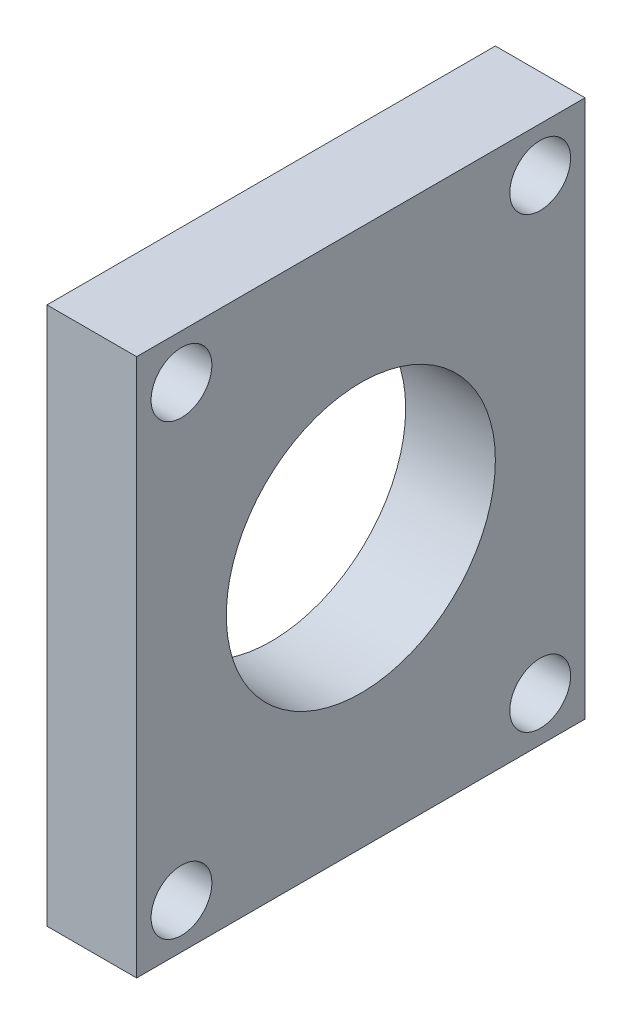
ISO-10303-21;
HEADER;
FILE_DESCRIPTION(('STEP AP214'),'2;1');
FILE_NAME('part.step','',(''),(''),'','','');
FILE_SCHEMA(('AUTOMOTIVE_DESIGN { 1 0 10303 214 1 1 1 1 }'));
ENDSEC;
DATA;
#1=APPLICATION_CONTEXT('core data for automotive mechanical design processes');
#2=APPLICATION_PROTOCOL_DEFINITION('international standard','automotive_design',2000,#1);
#3=PRODUCT_CONTEXT('',#1,'mechanical');
#4=PRODUCT('Part','Part','',(#3));
#5=PRODUCT_RELATED_PRODUCT_CATEGORY('part','',(#4));
#6=PRODUCT_DEFINITION_FORMATION('','',#4);
#7=PRODUCT_DEFINITION_CONTEXT('part definition',#1,'design');
#8=PRODUCT_DEFINITION('design','',#6,#7);
#9=PRODUCT_DEFINITION_SHAPE('','',#8);
#10=(LENGTH_UNIT() NAMED_UNIT(*) SI_UNIT(.MILLI.,.METRE.));
#11=(NAMED_UNIT(*) PLANE_ANGLE_UNIT() SI_UNIT($,.RADIAN.));
#12=(NAMED_UNIT(*) SI_UNIT($,.STERADIAN.) SOLID_ANGLE_UNIT());
#13=UNCERTAINTY_MEASURE_WITH_UNIT(LENGTH_MEASURE(1.E-05),#10,'distance_accuracy_value','');
#14=(GEOMETRIC_REPRESENTATION_CONTEXT(3) GLOBAL_UNCERTAINTY_ASSIGNED_CONTEXT((#13)) GLOBAL_UNIT_ASSIGNED_CONTEXT((#10,
#11,#12)) REPRESENTATION_CONTEXT('',''));
#15=CARTESIAN_POINT('',(0.,0.,0.));
#16=DIRECTION('',(0.,0.,1.));
#17=DIRECTION('',(1.,0.,0.));
#18=AXIS2_PLACEMENT_3D('',#15,#16,#17);
#19=CARTESIAN_POINT('',(3.175,0.,-15.875));
#20=DIRECTION('',(0.,0.,1.));
#21=DIRECTION('',(1.,0.,0.));
#22=AXIS2_PLACEMENT_3D('',#19,#20,#21);
#23=PLANE('',#22);
#24=DIRECTION('',(0.,1.,0.));
#25=VECTOR('',#24,1.);
#26=CARTESIAN_POINT('',(-3.175,0.,-15.875));
#27=LINE('',#26,#25);
#28=CARTESIAN_POINT('',(-3.175,0.,-15.875));
#29=VERTEX_POINT('',#28);
#30=CARTESIAN_POINT('',(-3.175,38.1,-15.875));
#31=VERTEX_POINT('',#30);
#32=EDGE_CURVE('E96',#29,#31,#27,.T.);
#33=ORIENTED_EDGE('',*,*,#32,.T.);
#34=DIRECTION('',(-1.,0.,0.));
#35=VECTOR('',#34,1.);
#36=CARTESIAN_POINT('',(3.175,38.1,-15.875));
#37=LINE('',#36,#35);
#38=CARTESIAN_POINT('',(3.175,38.1,-15.875));
#39=VERTEX_POINT('',#38);
#40=EDGE_CURVE('E11',#39,#31,#37,.T.);
#41=ORIENTED_EDGE('',*,*,#40,.F.);
#42=DIRECTION('',(0.,1.,0.));
#43=VECTOR('',#42,1.);
#44=CARTESIAN_POINT('',(3.175,0.,-15.875));
#45=LINE('',#44,#43);
#46=CARTESIAN_POINT('',(3.175,0.,-15.875));
#47=VERTEX_POINT('',#46);
#48=EDGE_CURVE('E84',#47,#39,#45,.T.);
#49=ORIENTED_EDGE('',*,*,#48,.F.);
#50=DIRECTION('',(-1.,0.,0.));
#51=VECTOR('',#50,1.);
#52=CARTESIAN_POINT('',(3.175,0.,-15.875));
#53=LINE('',#52,#51);
#54=EDGE_CURVE('E92',#47,#29,#53,.T.);
#55=ORIENTED_EDGE('',*,*,#54,.T.);
#56=EDGE_LOOP('',(#33,#41,#49,#55));
#57=FACE_BOUND('',#56,.T.);
#58=ADVANCED_FACE('F33',(#57),#23,.F.);
#59=CARTESIAN_POINT('',(3.175,38.1,-15.875));
#60=DIRECTION('',(0.,-1.,0.));
#61=DIRECTION('',(0.,0.,-1.));
#62=AXIS2_PLACEMENT_3D('',#59,#60,#61);
#63=PLANE('',#62);
#64=DIRECTION('',(0.,0.,1.));
#65=VECTOR('',#64,1.);
#66=CARTESIAN_POINT('',(-3.175,38.1,-15.875));
#67=LINE('',#66,#65);
#68=CARTESIAN_POINT('',(-3.175,38.1,15.875));
#69=VERTEX_POINT('',#68);
#70=EDGE_CURVE('E88',#31,#69,#67,.T.);
#71=ORIENTED_EDGE('',*,*,#70,.T.);
#72=DIRECTION('',(-1.,0.,0.));
#73=VECTOR('',#72,1.);
#74=CARTESIAN_POINT('',(3.175,38.1,15.875));
#75=LINE('',#74,#73);
#76=CARTESIAN_POINT('',(3.175,38.1,15.875));
#77=VERTEX_POINT('',#76);
#78=EDGE_CURVE('E41',#77,#69,#75,.T.);
#79=ORIENTED_EDGE('',*,*,#78,.F.);
#80=DIRECTION('',(0.,0.,1.));
#81=VECTOR('',#80,1.);
#82=CARTESIAN_POINT('',(3.175,38.1,-15.875));
#83=LINE('',#82,#81);
#84=EDGE_CURVE('E79',#39,#77,#83,.T.);
#85=ORIENTED_EDGE('',*,*,#84,.F.);
#86=ORIENTED_EDGE('',*,*,#40,.T.);
#87=EDGE_LOOP('',(#71,#79,#85,#86));
#88=FACE_BOUND('',#87,.T.);
#89=ADVANCED_FACE('F87',(#88),#63,.F.);
#90=CARTESIAN_POINT('',(3.175,0.,15.875));
#91=DIRECTION('',(0.,0.,-1.));
#92=DIRECTION('',(-1.,0.,0.));
#93=AXIS2_PLACEMENT_3D('',#90,#91,#92);
#94=PLANE('',#93);
#95=DIRECTION('',(0.,-1.,0.));
#96=VECTOR('',#95,1.);
#97=CARTESIAN_POINT('',(-3.175,0.,15.875));
#98=LINE('',#97,#96);
#99=CARTESIAN_POINT('',(-3.175,0.,15.875));
#100=VERTEX_POINT('',#99);
#101=EDGE_CURVE('E66',#69,#100,#98,.T.);
#102=ORIENTED_EDGE('',*,*,#101,.T.);
#103=DIRECTION('',(-1.,0.,0.));
#104=VECTOR('',#103,1.);
#105=CARTESIAN_POINT('',(3.175,0.,15.875));
#106=LINE('',#105,#104);
#107=CARTESIAN_POINT('',(3.175,0.,15.875));
#108=VERTEX_POINT('',#107);
#109=EDGE_CURVE('E89',#108,#100,#106,.T.);
#110=ORIENTED_EDGE('',*,*,#109,.F.);
#111=DIRECTION('',(0.,-1.,0.));
#112=VECTOR('',#111,1.);
#113=CARTESIAN_POINT('',(3.175,0.,15.875));
#114=LINE('',#113,#112);
#115=EDGE_CURVE('E82',#77,#108,#114,.T.);
#116=ORIENTED_EDGE('',*,*,#115,.F.);
#117=ORIENTED_EDGE('',*,*,#78,.T.);
#118=EDGE_LOOP('',(#102,#110,#116,#117));
#119=FACE_BOUND('',#118,.T.);
#120=ADVANCED_FACE('F90',(#119),#94,.F.);
#121=CARTESIAN_POINT('',(3.175,0.,-15.875));
#122=DIRECTION('',(0.,1.,0.));
#123=DIRECTION('',(0.,0.,1.));
#124=AXIS2_PLACEMENT_3D('',#121,#122,#123);
#125=PLANE('',#124);
#126=DIRECTION('',(0.,0.,-1.));
#127=VECTOR('',#126,1.);
#128=CARTESIAN_POINT('',(-3.175,0.,-15.875));
#129=LINE('',#128,#127);
#130=EDGE_CURVE('E72',#100,#29,#129,.T.);
#131=ORIENTED_EDGE('',*,*,#130,.T.);
#132=ORIENTED_EDGE('',*,*,#54,.F.);
#133=DIRECTION('',(0.,0.,-1.));
#134=VECTOR('',#133,1.);
#135=CARTESIAN_POINT('',(3.175,0.,-15.875));
#136=LINE('',#135,#134);
#137=EDGE_CURVE('E49',#108,#47,#136,.T.);
#138=ORIENTED_EDGE('',*,*,#137,.F.);
#139=ORIENTED_EDGE('',*,*,#109,.T.);
#140=EDGE_LOOP('',(#131,#132,#138,#139));
#141=FACE_BOUND('',#140,.T.);
#142=ADVANCED_FACE('F104',(#141),#125,.F.);
#143=CARTESIAN_POINT('',(3.175,0.,0.));
#144=DIRECTION('',(1.,0.,0.));
#145=DIRECTION('',(0.,0.,-1.));
#146=AXIS2_PLACEMENT_3D('',#143,#144,#145);
#147=PLANE('',#146);
#148=CARTESIAN_POINT('',(3.175,19.05,0.));
#149=DIRECTION('',(1.,0.,0.));
#150=DIRECTION('',(0.,0.,-1.));
#151=AXIS2_PLACEMENT_3D('',#148,#149,#150);
#152=CIRCLE('',#151,9.525);
#153=CARTESIAN_POINT('',(3.175,19.05,-9.525));
#154=VERTEX_POINT('',#153);
#155=EDGE_CURVE('E134',#154,#154,#152,.T.);
#156=ORIENTED_EDGE('',*,*,#155,.F.);
#157=EDGE_LOOP('',(#156));
#158=FACE_BOUND('',#157,.T.);
#159=CARTESIAN_POINT('',(3.175,34.925,12.7));
#160=DIRECTION('',(1.,0.,0.));
#161=DIRECTION('',(0.,0.,-1.));
#162=AXIS2_PLACEMENT_3D('',#159,#160,#161);
#163=CIRCLE('',#162,2.15265);
#164=CARTESIAN_POINT('',(3.175,34.925,10.54735));
#165=VERTEX_POINT('',#164);
#166=EDGE_CURVE('E129',#165,#165,#163,.T.);
#167=ORIENTED_EDGE('',*,*,#166,.F.);
#168=EDGE_LOOP('',(#167));
#169=FACE_BOUND('',#168,.T.);
#170=CARTESIAN_POINT('',(3.175,3.175,-12.7));
#171=DIRECTION('',(1.,0.,0.));
#172=DIRECTION('',(0.,0.,-1.));
#173=AXIS2_PLACEMENT_3D('',#170,#171,#172);
#174=CIRCLE('',#173,2.15265);
#175=CARTESIAN_POINT('',(3.175,3.175,-14.85265));
#176=VERTEX_POINT('',#175);
#177=EDGE_CURVE('E123',#176,#176,#174,.T.);
#178=ORIENTED_EDGE('',*,*,#177,.F.);
#179=EDGE_LOOP('',(#178));
#180=FACE_BOUND('',#179,.T.);
#181=CARTESIAN_POINT('',(3.175,34.925,-12.7));
#182=DIRECTION('',(1.,0.,0.));
#183=DIRECTION('',(0.,0.,-1.));
#184=AXIS2_PLACEMENT_3D('',#181,#182,#183);
#185=CIRCLE('',#184,2.15265);
#186=CARTESIAN_POINT('',(3.175,34.925,-14.85265));
#187=VERTEX_POINT('',#186);
#188=EDGE_CURVE('E116',#187,#187,#185,.T.);
#189=ORIENTED_EDGE('',*,*,#188,.F.);
#190=EDGE_LOOP('',(#189));
#191=FACE_BOUND('',#190,.T.);
#192=CARTESIAN_POINT('',(3.175,3.175,12.7));
#193=DIRECTION('',(1.,0.,0.));
#194=DIRECTION('',(0.,0.,-1.));
#195=AXIS2_PLACEMENT_3D('',#192,#193,#194);
#196=CIRCLE('',#195,2.15265);
#197=CARTESIAN_POINT('',(3.175,3.175,10.54735));
#198=VERTEX_POINT('',#197);
#199=EDGE_CURVE('E110',#198,#198,#196,.T.);
#200=ORIENTED_EDGE('',*,*,#199,.F.);
#201=EDGE_LOOP('',(#200));
#202=FACE_BOUND('',#201,.T.);
#203=ORIENTED_EDGE('',*,*,#48,.T.);
#204=ORIENTED_EDGE('',*,*,#84,.T.);
#205=ORIENTED_EDGE('',*,*,#115,.T.);
#206=ORIENTED_EDGE('',*,*,#137,.T.);
#207=EDGE_LOOP('',(#203,#204,#205,#206));
#208=FACE_BOUND('',#207,.T.);
#209=ADVANCED_FACE('F80',(#158,#169,#180,#191,#202,#208),#147,.T.);
#210=CARTESIAN_POINT('',(-3.175,0.,0.));
#211=DIRECTION('',(1.,0.,0.));
#212=DIRECTION('',(0.,0.,-1.));
#213=AXIS2_PLACEMENT_3D('',#210,#211,#212);
#214=PLANE('',#213);
#215=CARTESIAN_POINT('',(-3.175,19.05,0.));
#216=DIRECTION('',(1.,0.,0.));
#217=DIRECTION('',(0.,0.,-1.));
#218=AXIS2_PLACEMENT_3D('',#215,#216,#217);
#219=CIRCLE('',#218,9.525);
#220=CARTESIAN_POINT('',(-3.175,19.05,-9.525));
#221=VERTEX_POINT('',#220);
#222=EDGE_CURVE('E120',#221,#221,#219,.T.);
#223=ORIENTED_EDGE('',*,*,#222,.T.);
#224=EDGE_LOOP('',(#223));
#225=FACE_BOUND('',#224,.T.);
#226=CARTESIAN_POINT('',(-3.175,34.925,12.7));
#227=DIRECTION('',(1.,0.,0.));
#228=DIRECTION('',(0.,0.,-1.));
#229=AXIS2_PLACEMENT_3D('',#226,#227,#228);
#230=CIRCLE('',#229,2.15265);
#231=CARTESIAN_POINT('',(-3.175,34.925,10.54735));
#232=VERTEX_POINT('',#231);
#233=EDGE_CURVE('E113',#232,#232,#230,.T.);
#234=ORIENTED_EDGE('',*,*,#233,.T.);
#235=EDGE_LOOP('',(#234));
#236=FACE_BOUND('',#235,.T.);
#237=CARTESIAN_POINT('',(-3.175,3.175,-12.7));
#238=DIRECTION('',(1.,0.,0.));
#239=DIRECTION('',(0.,0.,-1.));
#240=AXIS2_PLACEMENT_3D('',#237,#238,#239);
#241=CIRCLE('',#240,2.15265);
#242=CARTESIAN_POINT('',(-3.175,3.175,-14.85265));
#243=VERTEX_POINT('',#242);
#244=EDGE_CURVE('E126',#243,#243,#241,.T.);
#245=ORIENTED_EDGE('',*,*,#244,.T.);
#246=EDGE_LOOP('',(#245));
#247=FACE_BOUND('',#246,.T.);
#248=CARTESIAN_POINT('',(-3.175,34.925,-12.7));
#249=DIRECTION('',(1.,0.,0.));
#250=DIRECTION('',(0.,0.,-1.));
#251=AXIS2_PLACEMENT_3D('',#248,#249,#250);
#252=CIRCLE('',#251,2.15265);
#253=CARTESIAN_POINT('',(-3.175,34.925,-14.85265));
#254=VERTEX_POINT('',#253);
#255=EDGE_CURVE('E119',#254,#254,#252,.T.);
#256=ORIENTED_EDGE('',*,*,#255,.T.);
#257=EDGE_LOOP('',(#256));
#258=FACE_BOUND('',#257,.T.);
#259=CARTESIAN_POINT('',(-3.175,3.175,12.7));
#260=DIRECTION('',(1.,0.,0.));
#261=DIRECTION('',(0.,0.,-1.));
#262=AXIS2_PLACEMENT_3D('',#259,#260,#261);
#263=CIRCLE('',#262,2.15265);
#264=CARTESIAN_POINT('',(-3.175,3.175,10.54735));
#265=VERTEX_POINT('',#264);
#266=EDGE_CURVE('E99',#265,#265,#263,.T.);
#267=ORIENTED_EDGE('',*,*,#266,.T.);
#268=EDGE_LOOP('',(#267));
#269=FACE_BOUND('',#268,.T.);
#270=ORIENTED_EDGE('',*,*,#32,.F.);
#271=ORIENTED_EDGE('',*,*,#130,.F.);
#272=ORIENTED_EDGE('',*,*,#101,.F.);
#273=ORIENTED_EDGE('',*,*,#70,.F.);
#274=EDGE_LOOP('',(#270,#271,#272,#273));
#275=FACE_BOUND('',#274,.T.);
#276=ADVANCED_FACE('F107',(#225,#236,#247,#258,#269,#275),#214,.F.);
#277=CARTESIAN_POINT('',(-3.175,3.175,12.7));
#278=DIRECTION('',(1.,0.,0.));
#279=DIRECTION('',(0.,0.,-1.));
#280=AXIS2_PLACEMENT_3D('',#277,#278,#279);
#281=CYLINDRICAL_SURFACE('',#280,2.15265);
#282=ORIENTED_EDGE('',*,*,#266,.F.);
#283=EDGE_LOOP('',(#282));
#284=FACE_BOUND('',#283,.T.);
#285=ORIENTED_EDGE('',*,*,#199,.T.);
#286=EDGE_LOOP('',(#285));
#287=FACE_BOUND('',#286,.T.);
#288=ADVANCED_FACE('F160',(#284,#287),#281,.F.);
#289=CARTESIAN_POINT('',(-3.175,34.925,-12.7));
#290=DIRECTION('',(1.,0.,0.));
#291=DIRECTION('',(0.,0.,-1.));
#292=AXIS2_PLACEMENT_3D('',#289,#290,#291);
#293=CYLINDRICAL_SURFACE('',#292,2.15265);
#294=ORIENTED_EDGE('',*,*,#255,.F.);
#295=EDGE_LOOP('',(#294));
#296=FACE_BOUND('',#295,.T.);
#297=ORIENTED_EDGE('',*,*,#188,.T.);
#298=EDGE_LOOP('',(#297));
#299=FACE_BOUND('',#298,.T.);
#300=ADVANCED_FACE('F162',(#296,#299),#293,.F.);
#301=CARTESIAN_POINT('',(-3.175,3.175,-12.7));
#302=DIRECTION('',(1.,0.,0.));
#303=DIRECTION('',(0.,0.,-1.));
#304=AXIS2_PLACEMENT_3D('',#301,#302,#303);
#305=CYLINDRICAL_SURFACE('',#304,2.15265);
#306=ORIENTED_EDGE('',*,*,#244,.F.);
#307=EDGE_LOOP('',(#306));
#308=FACE_BOUND('',#307,.T.);
#309=ORIENTED_EDGE('',*,*,#177,.T.);
#310=EDGE_LOOP('',(#309));
#311=FACE_BOUND('',#310,.T.);
#312=ADVANCED_FACE('F169',(#308,#311),#305,.F.);
#313=CARTESIAN_POINT('',(-3.175,34.925,12.7));
#314=DIRECTION('',(1.,0.,0.));
#315=DIRECTION('',(0.,0.,-1.));
#316=AXIS2_PLACEMENT_3D('',#313,#314,#315);
#317=CYLINDRICAL_SURFACE('',#316,2.15265);
#318=ORIENTED_EDGE('',*,*,#233,.F.);
#319=EDGE_LOOP('',(#318));
#320=FACE_BOUND('',#319,.T.);
#321=ORIENTED_EDGE('',*,*,#166,.T.);
#322=EDGE_LOOP('',(#321));
#323=FACE_BOUND('',#322,.T.);
#324=ADVANCED_FACE('F145',(#320,#323),#317,.F.);
#325=CARTESIAN_POINT('',(-3.175,19.05,0.));
#326=DIRECTION('',(1.,0.,0.));
#327=DIRECTION('',(0.,0.,-1.));
#328=AXIS2_PLACEMENT_3D('',#325,#326,#327);
#329=CYLINDRICAL_SURFACE('',#328,9.525);
#330=ORIENTED_EDGE('',*,*,#222,.F.);
#331=EDGE_LOOP('',(#330));
#332=FACE_BOUND('',#331,.T.);
#333=ORIENTED_EDGE('',*,*,#155,.T.);
#334=EDGE_LOOP('',(#333));
#335=FACE_BOUND('',#334,.T.);
#336=ADVANCED_FACE('F142',(#332,#335),#329,.F.);
#337=CLOSED_SHELL('',(#58,#89,#120,#142,#209,#276,#288,#300,#312,#324,#336));
#338=MANIFOLD_SOLID_BREP('B2',#337);
#339=ADVANCED_BREP_SHAPE_REPRESENTATION('',(#18,#338),#14);
#340=SHAPE_DEFINITION_REPRESENTATION(#9,#339);
ENDSEC;
END-ISO-10303-21;
